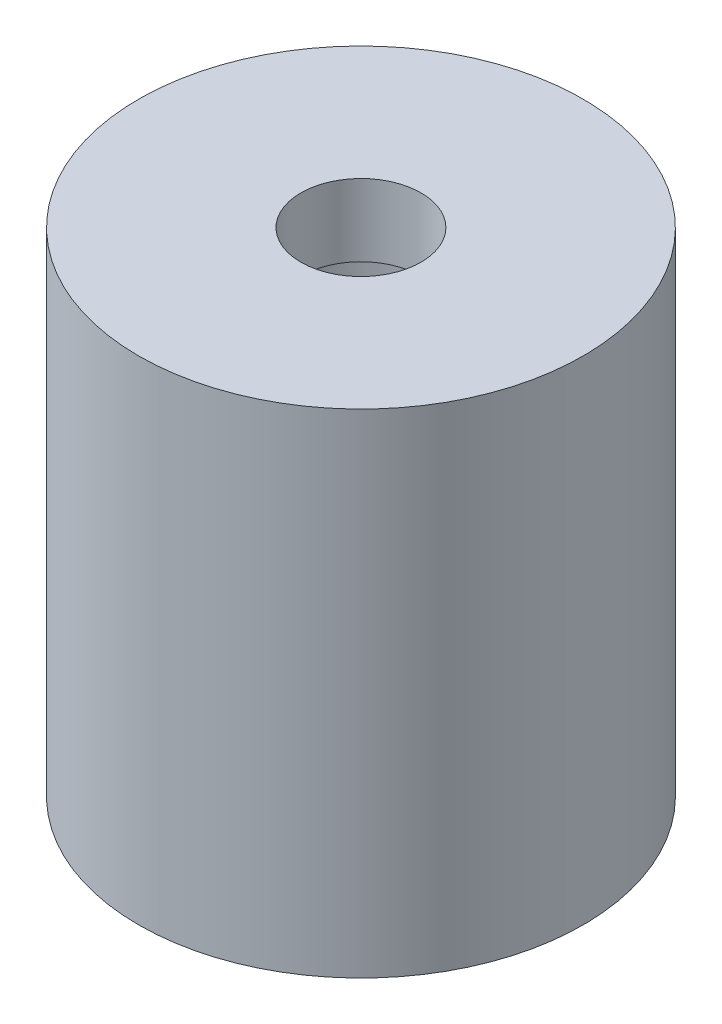
ISO-10303-21;
HEADER;
FILE_DESCRIPTION(('STEP AP214'),'2;1');
FILE_NAME('part.step','',(''),(''),'','','');
FILE_SCHEMA(('AUTOMOTIVE_DESIGN { 1 0 10303 214 1 1 1 1 }'));
ENDSEC;
DATA;
#1=APPLICATION_CONTEXT('core data for automotive mechanical design processes');
#2=APPLICATION_PROTOCOL_DEFINITION('international standard','automotive_design',2000,#1);
#3=PRODUCT_CONTEXT('',#1,'mechanical');
#4=PRODUCT('Part','Part','',(#3));
#5=PRODUCT_RELATED_PRODUCT_CATEGORY('part','',(#4));
#6=PRODUCT_DEFINITION_FORMATION('','',#4);
#7=PRODUCT_DEFINITION_CONTEXT('part definition',#1,'design');
#8=PRODUCT_DEFINITION('design','',#6,#7);
#9=PRODUCT_DEFINITION_SHAPE('','',#8);
#10=(LENGTH_UNIT() NAMED_UNIT(*) SI_UNIT(.MILLI.,.METRE.));
#11=(NAMED_UNIT(*) PLANE_ANGLE_UNIT() SI_UNIT($,.RADIAN.));
#12=(NAMED_UNIT(*) SI_UNIT($,.STERADIAN.) SOLID_ANGLE_UNIT());
#13=UNCERTAINTY_MEASURE_WITH_UNIT(LENGTH_MEASURE(1.E-05),#10,'distance_accuracy_value','');
#14=(GEOMETRIC_REPRESENTATION_CONTEXT(3) GLOBAL_UNCERTAINTY_ASSIGNED_CONTEXT((#13)) GLOBAL_UNIT_ASSIGNED_CONTEXT((#10,
#11,#12)) REPRESENTATION_CONTEXT('',''));
#15=CARTESIAN_POINT('',(0.,0.,0.));
#16=DIRECTION('',(0.,0.,1.));
#17=DIRECTION('',(1.,0.,0.));
#18=AXIS2_PLACEMENT_3D('',#15,#16,#17);
#19=CARTESIAN_POINT('',(0.,0.,0.));
#20=DIRECTION('',(0.,1.,0.));
#21=DIRECTION('',(0.,0.,1.));
#22=AXIS2_PLACEMENT_3D('',#19,#20,#21);
#23=PLANE('',#22);
#24=CARTESIAN_POINT('',(0.,0.,0.));
#25=DIRECTION('',(0.,1.,0.));
#26=DIRECTION('',(0.,0.,1.));
#27=AXIS2_PLACEMENT_3D('',#24,#25,#26);
#28=CIRCLE('',#27,37.);
#29=CARTESIAN_POINT('',(0.,0.,37.));
#30=VERTEX_POINT('',#29);
#31=EDGE_CURVE('E10',#30,#30,#28,.T.);
#32=ORIENTED_EDGE('',*,*,#31,.F.);
#33=EDGE_LOOP('',(#32));
#34=FACE_BOUND('',#33,.T.);
#35=CARTESIAN_POINT('',(0.,0.,0.));
#36=DIRECTION('',(0.,1.,0.));
#37=DIRECTION('',(0.,0.,1.));
#38=AXIS2_PLACEMENT_3D('',#35,#36,#37);
#39=CIRCLE('',#38,20.);
#40=CARTESIAN_POINT('',(0.,0.,20.));
#41=VERTEX_POINT('',#40);
#42=EDGE_CURVE('E41',#41,#41,#39,.T.);
#43=ORIENTED_EDGE('',*,*,#42,.T.);
#44=EDGE_LOOP('',(#43));
#45=FACE_BOUND('',#44,.T.);
#46=ADVANCED_FACE('F34',(#34,#45),#23,.F.);
#47=CARTESIAN_POINT('',(0.,70.,0.));
#48=DIRECTION('',(0.,-1.,0.));
#49=DIRECTION('',(0.,0.,-1.));
#50=AXIS2_PLACEMENT_3D('',#47,#48,#49);
#51=CYLINDRICAL_SURFACE('',#50,37.);
#52=ORIENTED_EDGE('',*,*,#31,.T.);
#53=EDGE_LOOP('',(#52));
#54=FACE_BOUND('',#53,.T.);
#55=CARTESIAN_POINT('',(0.,82.,0.));
#56=DIRECTION('',(0.,1.,0.));
#57=DIRECTION('',(0.,0.,1.));
#58=AXIS2_PLACEMENT_3D('',#55,#56,#57);
#59=CIRCLE('',#58,37.);
#60=CARTESIAN_POINT('',(0.,82.,37.));
#61=VERTEX_POINT('',#60);
#62=EDGE_CURVE('E49',#61,#61,#59,.T.);
#63=ORIENTED_EDGE('',*,*,#62,.F.);
#64=EDGE_LOOP('',(#63));
#65=FACE_BOUND('',#64,.T.);
#66=ADVANCED_FACE('F36',(#54,#65),#51,.T.);
#67=CARTESIAN_POINT('',(0.,70.,0.));
#68=DIRECTION('',(0.,-1.,0.));
#69=DIRECTION('',(0.,0.,-1.));
#70=AXIS2_PLACEMENT_3D('',#67,#68,#69);
#71=CYLINDRICAL_SURFACE('',#70,20.);
#72=CARTESIAN_POINT('',(0.,70.,0.));
#73=DIRECTION('',(0.,1.,0.));
#74=DIRECTION('',(0.,0.,1.));
#75=AXIS2_PLACEMENT_3D('',#72,#73,#74);
#76=CIRCLE('',#75,20.);
#77=CARTESIAN_POINT('',(0.,70.,20.));
#78=VERTEX_POINT('',#77);
#79=EDGE_CURVE('E45',#78,#78,#76,.T.);
#80=ORIENTED_EDGE('',*,*,#79,.T.);
#81=EDGE_LOOP('',(#80));
#82=FACE_BOUND('',#81,.T.);
#83=ORIENTED_EDGE('',*,*,#42,.F.);
#84=EDGE_LOOP('',(#83));
#85=FACE_BOUND('',#84,.T.);
#86=ADVANCED_FACE('F74',(#82,#85),#71,.F.);
#87=CARTESIAN_POINT('',(0.,70.,0.));
#88=DIRECTION('',(0.,1.,0.));
#89=DIRECTION('',(0.,0.,1.));
#90=AXIS2_PLACEMENT_3D('',#87,#88,#89);
#91=PLANE('',#90);
#92=CARTESIAN_POINT('',(0.,70.,0.));
#93=DIRECTION('',(0.,1.,0.));
#94=DIRECTION('',(0.,0.,1.));
#95=AXIS2_PLACEMENT_3D('',#92,#93,#94);
#96=CIRCLE('',#95,10.);
#97=CARTESIAN_POINT('',(0.,70.,10.));
#98=VERTEX_POINT('',#97);
#99=EDGE_CURVE('E55',#98,#98,#96,.T.);
#100=ORIENTED_EDGE('',*,*,#99,.T.);
#101=EDGE_LOOP('',(#100));
#102=FACE_BOUND('',#101,.T.);
#103=ORIENTED_EDGE('',*,*,#79,.F.);
#104=EDGE_LOOP('',(#103));
#105=FACE_BOUND('',#104,.T.);
#106=ADVANCED_FACE('F66',(#102,#105),#91,.F.);
#107=CARTESIAN_POINT('',(0.,82.,0.));
#108=DIRECTION('',(0.,1.,0.));
#109=DIRECTION('',(0.,0.,1.));
#110=AXIS2_PLACEMENT_3D('',#107,#108,#109);
#111=PLANE('',#110);
#112=ORIENTED_EDGE('',*,*,#62,.T.);
#113=EDGE_LOOP('',(#112));
#114=FACE_BOUND('',#113,.T.);
#115=CARTESIAN_POINT('',(0.,82.,0.));
#116=DIRECTION('',(0.,1.,0.));
#117=DIRECTION('',(0.,0.,1.));
#118=AXIS2_PLACEMENT_3D('',#115,#116,#117);
#119=CIRCLE('',#118,10.);
#120=CARTESIAN_POINT('',(0.,82.,10.));
#121=VERTEX_POINT('',#120);
#122=EDGE_CURVE('E54',#121,#121,#119,.T.);
#123=ORIENTED_EDGE('',*,*,#122,.F.);
#124=EDGE_LOOP('',(#123));
#125=FACE_BOUND('',#124,.T.);
#126=ADVANCED_FACE('F64',(#114,#125),#111,.T.);
#127=CARTESIAN_POINT('',(0.,82.,0.));
#128=DIRECTION('',(0.,-1.,0.));
#129=DIRECTION('',(0.,0.,-1.));
#130=AXIS2_PLACEMENT_3D('',#127,#128,#129);
#131=CYLINDRICAL_SURFACE('',#130,10.);
#132=ORIENTED_EDGE('',*,*,#122,.T.);
#133=EDGE_LOOP('',(#132));
#134=FACE_BOUND('',#133,.T.);
#135=ORIENTED_EDGE('',*,*,#99,.F.);
#136=EDGE_LOOP('',(#135));
#137=FACE_BOUND('',#136,.T.);
#138=ADVANCED_FACE('F61',(#134,#137),#131,.F.);
#139=CLOSED_SHELL('',(#46,#66,#86,#106,#126,#138));
#140=MANIFOLD_SOLID_BREP('B2',#139);
#141=ADVANCED_BREP_SHAPE_REPRESENTATION('',(#18,#140),#14);
#142=SHAPE_DEFINITION_REPRESENTATION(#9,#141);
ENDSEC;
END-ISO-10303-21;
